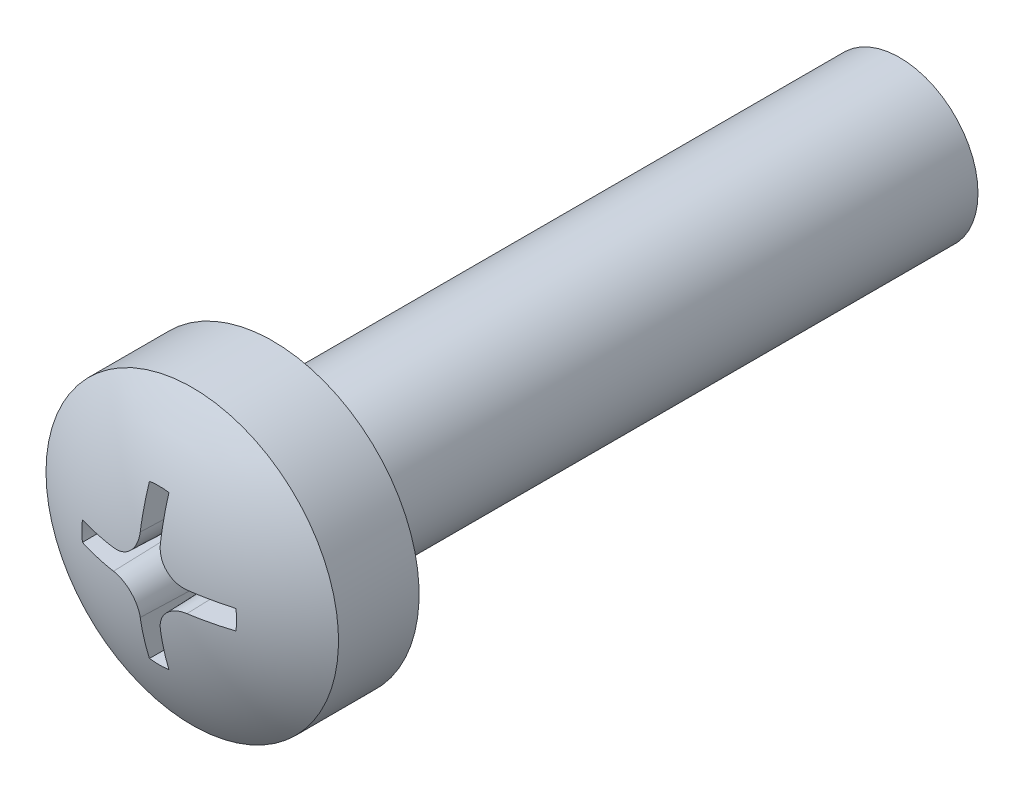
ISO-10303-21;
HEADER;
FILE_DESCRIPTION(('STEP AP214'),'2;1');
FILE_NAME('part.step','',(''),(''),'','','');
FILE_SCHEMA(('AUTOMOTIVE_DESIGN { 1 0 10303 214 1 1 1 1 }'));
ENDSEC;
DATA;
#1=APPLICATION_CONTEXT('core data for automotive mechanical design processes');
#2=APPLICATION_PROTOCOL_DEFINITION('international standard','automotive_design',2000,#1);
#3=PRODUCT_CONTEXT('',#1,'mechanical');
#4=PRODUCT('Part','Part','',(#3));
#5=PRODUCT_RELATED_PRODUCT_CATEGORY('part','',(#4));
#6=PRODUCT_DEFINITION_FORMATION('','',#4);
#7=PRODUCT_DEFINITION_CONTEXT('part definition',#1,'design');
#8=PRODUCT_DEFINITION('design','',#6,#7);
#9=PRODUCT_DEFINITION_SHAPE('','',#8);
#10=(LENGTH_UNIT() NAMED_UNIT(*) SI_UNIT(.MILLI.,.METRE.));
#11=(NAMED_UNIT(*) PLANE_ANGLE_UNIT() SI_UNIT($,.RADIAN.));
#12=(NAMED_UNIT(*) SI_UNIT($,.STERADIAN.) SOLID_ANGLE_UNIT());
#13=UNCERTAINTY_MEASURE_WITH_UNIT(LENGTH_MEASURE(1.E-05),#10,'distance_accuracy_value','');
#14=(GEOMETRIC_REPRESENTATION_CONTEXT(3) GLOBAL_UNCERTAINTY_ASSIGNED_CONTEXT((#13)) GLOBAL_UNIT_ASSIGNED_CONTEXT((#10,
#11,#12)) REPRESENTATION_CONTEXT('',''));
#15=CARTESIAN_POINT('',(0.,0.,0.));
#16=DIRECTION('',(0.,0.,1.));
#17=DIRECTION('',(1.,0.,0.));
#18=AXIS2_PLACEMENT_3D('',#15,#16,#17);
#19=CARTESIAN_POINT('',(0.,0.,12.));
#20=DIRECTION('',(0.,0.,-1.));
#21=DIRECTION('',(-1.,0.,0.));
#22=AXIS2_PLACEMENT_3D('',#19,#20,#21);
#23=CYLINDRICAL_SURFACE('',#22,1.5);
#24=CARTESIAN_POINT('',(0.,0.,12.));
#25=DIRECTION('',(0.,0.,1.));
#26=DIRECTION('',(1.,0.,0.));
#27=AXIS2_PLACEMENT_3D('',#24,#25,#26);
#28=CIRCLE('',#27,1.5);
#29=CARTESIAN_POINT('',(1.5,0.,12.));
#30=VERTEX_POINT('',#29);
#31=EDGE_CURVE('E206',#30,#30,#28,.T.);
#32=ORIENTED_EDGE('',*,*,#31,.F.);
#33=EDGE_LOOP('',(#32));
#34=FACE_BOUND('',#33,.T.);
#35=CARTESIAN_POINT('',(0.,0.,0.));
#36=DIRECTION('',(0.,0.,1.));
#37=DIRECTION('',(1.,0.,0.));
#38=AXIS2_PLACEMENT_3D('',#35,#36,#37);
#39=CIRCLE('',#38,1.5);
#40=CARTESIAN_POINT('',(1.5,0.,0.));
#41=VERTEX_POINT('',#40);
#42=EDGE_CURVE('E205',#41,#41,#39,.T.);
#43=ORIENTED_EDGE('',*,*,#42,.T.);
#44=EDGE_LOOP('',(#43));
#45=FACE_BOUND('',#44,.T.);
#46=ADVANCED_FACE('F34',(#34,#45),#23,.T.);
#47=CARTESIAN_POINT('',(0.,0.,0.));
#48=DIRECTION('',(0.,0.,1.));
#49=DIRECTION('',(1.,0.,0.));
#50=AXIS2_PLACEMENT_3D('',#47,#48,#49);
#51=PLANE('',#50);
#52=ORIENTED_EDGE('',*,*,#42,.F.);
#53=EDGE_LOOP('',(#52));
#54=FACE_BOUND('',#53,.T.);
#55=ADVANCED_FACE('F295',(#54),#51,.F.);
#56=CARTESIAN_POINT('',(0.,0.,12.));
#57=DIRECTION('',(0.,0.,-1.));
#58=DIRECTION('',(-1.,0.,0.));
#59=AXIS2_PLACEMENT_3D('',#56,#57,#58);
#60=PLANE('',#59);
#61=CARTESIAN_POINT('',(0.,0.,12.));
#62=DIRECTION('',(0.,0.,-1.));
#63=DIRECTION('',(-1.,0.,0.));
#64=AXIS2_PLACEMENT_3D('',#61,#62,#63);
#65=CIRCLE('',#64,2.79999990016222);
#66=CARTESIAN_POINT('',(-2.79999990016222,0.,12.));
#67=VERTEX_POINT('',#66);
#68=EDGE_CURVE('E202',#67,#67,#65,.T.);
#69=ORIENTED_EDGE('',*,*,#68,.T.);
#70=EDGE_LOOP('',(#69));
#71=FACE_BOUND('',#70,.T.);
#72=ORIENTED_EDGE('',*,*,#31,.T.);
#73=EDGE_LOOP('',(#72));
#74=FACE_BOUND('',#73,.T.);
#75=ADVANCED_FACE('F300',(#71,#74),#60,.T.);
#76=CARTESIAN_POINT('',(0.,0.,-0.393620134621003));
#77=DIRECTION('',(0.,0.,-1.));
#78=DIRECTION('',(-1.,0.,0.));
#79=AXIS2_PLACEMENT_3D('',#76,#77,#78);
#80=CYLINDRICAL_SURFACE('',#79,2.79999990016222);
#81=CARTESIAN_POINT('',(0.,0.,13.5424630797893));
#82=DIRECTION('',(0.,0.,-1.));
#83=DIRECTION('',(-1.,0.,0.));
#84=AXIS2_PLACEMENT_3D('',#81,#82,#83);
#85=CIRCLE('',#84,2.79999990016222);
#86=CARTESIAN_POINT('',(-2.79999990016222,0.,13.5424630797893));
#87=VERTEX_POINT('',#86);
#88=EDGE_CURVE('E150',#87,#87,#85,.T.);
#89=ORIENTED_EDGE('',*,*,#88,.T.);
#90=EDGE_LOOP('',(#89));
#91=FACE_BOUND('',#90,.T.);
#92=ORIENTED_EDGE('',*,*,#68,.F.);
#93=EDGE_LOOP('',(#92));
#94=FACE_BOUND('',#93,.T.);
#95=ADVANCED_FACE('F307',(#91,#94),#80,.T.);
#96=CARTESIAN_POINT('',(0.,0.,9.40000011175871));
#97=DIRECTION('',(0.,0.,-1.));
#98=DIRECTION('',(1.,0.,0.));
#99=AXIS2_PLACEMENT_3D('',#96,#97,#98);
#100=SPHERICAL_SURFACE('',#99,4.99999988824129);
#101=CARTESIAN_POINT('',(0.,0.,14.1754183821502));
#102=DIRECTION('',(0.,0.,-1.));
#103=DIRECTION('',(-1.,0.,0.));
#104=AXIS2_PLACEMENT_3D('',#101,#102,#103);
#105=CIRCLE('',#104,1.4816812157899);
#106=CARTESIAN_POINT('',(0.18668120666759,1.46987392394782,14.1754183821501));
#107=VERTEX_POINT('',#106);
#108=CARTESIAN_POINT('',(-0.186681206667593,1.46987392394782,14.1754183821501));
#109=VERTEX_POINT('',#108);
#110=EDGE_CURVE('E11',#107,#109,#105,.F.);
#111=ORIENTED_EDGE('',*,*,#110,.F.);
#112=CARTESIAN_POINT('',(0.0198956640512633,0.,9.39930533986049));
#113=DIRECTION('',(0.999390827019096,0.,-0.034899496702501));
#114=DIRECTION('',(-0.034899496702501,0.,-0.999390827019096));
#115=AXIS2_PLACEMENT_3D('',#112,#113,#114);
#116=CIRCLE('',#115,4.99996025606773);
#117=CARTESIAN_POINT('',(0.192632610704328,0.708178557647151,14.3458442955351));
#118=VERTEX_POINT('',#117);
#119=EDGE_CURVE('E41',#107,#118,#116,.T.);
#120=ORIENTED_EDGE('',*,*,#119,.T.);
#121=CARTESIAN_POINT('',(0.192631650862954,0.708378557647151,14.345815691475));
#122=CARTESIAN_POINT('',(0.192737639690806,0.679822741796073,14.3499041439734));
#123=CARTESIAN_POINT('',(0.195268867839181,0.651227392830896,14.3536463362414));
#124=CARTESIAN_POINT('',(0.205046889209158,0.59476703827459,14.3603460551712));
#125=CARTESIAN_POINT('',(0.212292618678018,0.566901869404939,14.3633037586285));
#126=CARTESIAN_POINT('',(0.231373694375068,0.51267267841366,14.3683466063254));
#127=CARTESIAN_POINT('',(0.24321326807329,0.486310064716558,14.3704309431667));
#128=CARTESIAN_POINT('',(0.271156607880554,0.435900324544809,14.3736603491012));
#129=CARTESIAN_POINT('',(0.287258672100205,0.411852279143786,14.3748057923215));
#130=CARTESIAN_POINT('',(0.323072075489885,0.367028886470806,14.3761158025717));
#131=CARTESIAN_POINT('',(0.342740648168188,0.346219679514825,14.3762912893596));
#132=CARTESIAN_POINT('',(0.385246757538768,0.30814670944778,14.3756853456951));
#133=CARTESIAN_POINT('',(0.408084792807392,0.290883505206881,14.3749037645383));
#134=CARTESIAN_POINT('',(0.456147210008961,0.260464262414973,14.3724133951705));
#135=CARTESIAN_POINT('',(0.481359759209805,0.247289131136679,14.3707090224733));
#136=CARTESIAN_POINT('',(0.533541444049374,0.225283958921734,14.3664258870809));
#137=CARTESIAN_POINT('',(0.560509920861877,0.216452298826715,14.3638474508254));
#138=CARTESIAN_POINT('',(0.606876295057338,0.205379627868596,14.3588207651558));
#139=CARTESIAN_POINT('',(0.626020977094074,0.201943221890059,14.3565812960749));
#140=CARTESIAN_POINT('',(0.66450204404321,0.197253494550336,14.3517582366185));
#141=CARTESIAN_POINT('',(0.683838077649067,0.195996727127303,14.349175196413));
#142=CARTESIAN_POINT('',(0.703167546290468,0.195835015722445,14.3464334662955));
#143=B_SPLINE_CURVE_WITH_KNOTS('',3,(#121,#122,#123,#124,#125,#126,#127,#128,#129,#130,#131,
#132,#133,#134,#135,#136,#137,#138,#139,#140,#141,#142),.UNSPECIFIED.,.F.,.F.,(4,2,2,2,2,2,2,2,
2,2,4),(0.,0.0864417829586744,0.172864068455127,0.259366073122684,0.345833591994609,
0.431325646912079,0.516831165542016,0.601931114274005,0.686999315371811,0.745618262708562,
0.804144447281415),.UNSPECIFIED.);
#144=CARTESIAN_POINT('',(0.702917362553185,0.19583721033533,14.3464689381926));
#145=VERTEX_POINT('',#144);
#146=EDGE_CURVE('E277',#118,#145,#143,.T.);
#147=ORIENTED_EDGE('',*,*,#146,.T.);
#148=CARTESIAN_POINT('',(0.00010539015335094,0.0259265633149154,9.39909472873738));
#149=DIRECTION('',(0.00406243901494415,0.999382570249833,-0.034899496702501));
#150=DIRECTION('',(0.,0.0348997846864301,0.999390816962434));
#151=AXIS2_PLACEMENT_3D('',#148,#149,#150);
#152=CIRCLE('',#151,4.99993258603575);
#153=CARTESIAN_POINT('',(1.46986565043204,0.186746338396853,14.1754183821502));
#154=VERTEX_POINT('',#153);
#155=EDGE_CURVE('E275',#154,#145,#152,.F.);
#156=ORIENTED_EDGE('',*,*,#155,.F.);
#157=CARTESIAN_POINT('',(0.,0.,14.1754183821502));
#158=DIRECTION('',(0.,0.,-1.));
#159=DIRECTION('',(-1.,0.,0.));
#160=AXIS2_PLACEMENT_3D('',#157,#158,#159);
#161=CIRCLE('',#160,1.4816812157899);
#162=CARTESIAN_POINT('',(1.46986565043204,-0.186746338396852,14.1754183821501));
#163=VERTEX_POINT('',#162);
#164=EDGE_CURVE('E273',#163,#154,#161,.F.);
#165=ORIENTED_EDGE('',*,*,#164,.F.);
#166=CARTESIAN_POINT('',(0.000105390153350971,-0.0259265633149169,9.39909472873738));
#167=DIRECTION('',(0.00406243901494512,-0.999382570249833,-0.034899496702501));
#168=DIRECTION('',(0.,0.0348997846864301,-0.999390816962434));
#169=AXIS2_PLACEMENT_3D('',#166,#167,#168);
#170=CIRCLE('',#169,4.99993258603575);
#171=CARTESIAN_POINT('',(0.702917362553185,-0.195837210335331,14.3464689381926));
#172=VERTEX_POINT('',#171);
#173=EDGE_CURVE('E270',#163,#172,#170,.T.);
#174=ORIENTED_EDGE('',*,*,#173,.T.);
#175=CARTESIAN_POINT('',(0.192631650862954,-0.708378557647152,14.345815691475));
#176=CARTESIAN_POINT('',(0.192737639690806,-0.679822741796074,14.3499041439734));
#177=CARTESIAN_POINT('',(0.195268867839181,-0.651227392830896,14.3536463362414));
#178=CARTESIAN_POINT('',(0.205046889209158,-0.59476703827459,14.3603460551712));
#179=CARTESIAN_POINT('',(0.212292618678018,-0.56690186940494,14.3633037586285));
#180=CARTESIAN_POINT('',(0.231373694375068,-0.512672678413661,14.3683466063254));
#181=CARTESIAN_POINT('',(0.24321326807329,-0.486310064716559,14.3704309431667));
#182=CARTESIAN_POINT('',(0.271156607880554,-0.435900324544809,14.3736603491012));
#183=CARTESIAN_POINT('',(0.287258672100205,-0.411852279143786,14.3748057923215));
#184=CARTESIAN_POINT('',(0.323072075489885,-0.367028886470807,14.3761158025717));
#185=CARTESIAN_POINT('',(0.342740648168188,-0.346219679514826,14.3762912893596));
#186=CARTESIAN_POINT('',(0.385246757538768,-0.308146709447781,14.3756853456951));
#187=CARTESIAN_POINT('',(0.408084792807392,-0.290883505206882,14.3749037645383));
#188=CARTESIAN_POINT('',(0.456147210008961,-0.260464262414974,14.3724133951705));
#189=CARTESIAN_POINT('',(0.481359759209805,-0.247289131136679,14.3707090224733));
#190=CARTESIAN_POINT('',(0.533541444049374,-0.225283958921735,14.3664258870809));
#191=CARTESIAN_POINT('',(0.560509920861878,-0.216452298826716,14.3638474508254));
#192=CARTESIAN_POINT('',(0.606876295057338,-0.205379627868597,14.3588207651558));
#193=CARTESIAN_POINT('',(0.626020977094074,-0.201943221890059,14.3565812960749));
#194=CARTESIAN_POINT('',(0.66450204404321,-0.197253494550336,14.3517582366185));
#195=CARTESIAN_POINT('',(0.683838077649067,-0.195996727127304,14.349175196413));
#196=CARTESIAN_POINT('',(0.703167546290467,-0.195835015722445,14.3464334662955));
#197=B_SPLINE_CURVE_WITH_KNOTS('',3,(#175,#176,#177,#178,#179,#180,#181,#182,#183,#184,#185,
#186,#187,#188,#189,#190,#191,#192,#193,#194,#195,#196),.UNSPECIFIED.,.F.,.F.,(4,2,2,2,2,2,2,2,
2,2,4),(0.,0.0864417829586746,0.172864068455127,0.259366073122684,0.345833591994609,
0.431325646912079,0.516831165542017,0.601931114274005,0.686999315371811,0.745618262708562,
0.804144447281414),.UNSPECIFIED.);
#198=CARTESIAN_POINT('',(0.192632610704328,-0.708178557647152,14.3458442955351));
#199=VERTEX_POINT('',#198);
#200=EDGE_CURVE('E264',#199,#172,#197,.T.);
#201=ORIENTED_EDGE('',*,*,#200,.F.);
#202=CARTESIAN_POINT('',(0.0198956640512633,0.,9.39930533986049));
#203=DIRECTION('',(0.999390827019096,0.,-0.034899496702501));
#204=DIRECTION('',(-0.034899496702501,0.,-0.999390827019096));
#205=AXIS2_PLACEMENT_3D('',#202,#203,#204);
#206=CIRCLE('',#205,4.99996025606773);
#207=CARTESIAN_POINT('',(0.186681206667591,-1.46987392394782,14.1754183821502));
#208=VERTEX_POINT('',#207);
#209=EDGE_CURVE('E262',#208,#199,#206,.F.);
#210=ORIENTED_EDGE('',*,*,#209,.F.);
#211=CARTESIAN_POINT('',(0.,0.,14.1754183821502));
#212=DIRECTION('',(0.,0.,-1.));
#213=DIRECTION('',(-1.,0.,0.));
#214=AXIS2_PLACEMENT_3D('',#211,#212,#213);
#215=CIRCLE('',#214,1.4816812157899);
#216=CARTESIAN_POINT('',(-0.186681206667593,-1.46987392394782,14.1754183821501));
#217=VERTEX_POINT('',#216);
#218=EDGE_CURVE('E259',#208,#217,#215,.T.);
#219=ORIENTED_EDGE('',*,*,#218,.T.);
#220=CARTESIAN_POINT('',(-0.0198956640512654,0.,9.39930533986049));
#221=DIRECTION('',(-0.999390827019096,0.,-0.034899496702501));
#222=DIRECTION('',(-0.034899496702501,0.,0.999390827019096));
#223=AXIS2_PLACEMENT_3D('',#220,#221,#222);
#224=CIRCLE('',#223,4.99996025606773);
#225=CARTESIAN_POINT('',(-0.19263261070433,-0.708178557647151,14.3458442955351));
#226=VERTEX_POINT('',#225);
#227=EDGE_CURVE('E255',#217,#226,#224,.T.);
#228=ORIENTED_EDGE('',*,*,#227,.T.);
#229=CARTESIAN_POINT('',(-0.70316754629047,-0.195835015722445,14.3464334662955));
#230=CARTESIAN_POINT('',(-0.674619447950853,-0.196052963217916,14.3504857241648));
#231=CARTESIAN_POINT('',(-0.64604143463723,-0.198695168407334,14.3541890416191));
#232=CARTESIAN_POINT('',(-0.589634494727846,-0.208689654905481,14.3608068014756));
#233=CARTESIAN_POINT('',(-0.561805393198953,-0.216040826152062,14.3637214295682));
#234=CARTESIAN_POINT('',(-0.50766612082123,-0.235323893103952,14.3686750861046));
#235=CARTESIAN_POINT('',(-0.481357369172765,-0.247259991703852,14.370713307523));
#236=CARTESIAN_POINT('',(-0.431071022991569,-0.275383990623327,14.3738489099634));
#237=CARTESIAN_POINT('',(-0.407092510169895,-0.291570206692358,14.3749466629444));
#238=CARTESIAN_POINT('',(-0.362416703115867,-0.327538701485094,14.3761618083202));
#239=CARTESIAN_POINT('',(-0.34168588735275,-0.347278991317759,14.376289966384));
#240=CARTESIAN_POINT('',(-0.303780328011577,-0.389912448398922,14.375590364716));
#241=CARTESIAN_POINT('',(-0.286606147147997,-0.412806113607388,14.3747624538554));
#242=CARTESIAN_POINT('',(-0.256366858084051,-0.460969475916929,14.3721816258056));
#243=CARTESIAN_POINT('',(-0.243283863198687,-0.486228184526672,14.3704328274806));
#244=CARTESIAN_POINT('',(-0.22146899790456,-0.538485231439468,14.366063898297));
#245=CARTESIAN_POINT('',(-0.212735526227358,-0.565482925398504,14.3634440886927));
#246=CARTESIAN_POINT('',(-0.201823996880683,-0.61191361527353,14.3583478129874));
#247=CARTESIAN_POINT('',(-0.198453223120025,-0.631098599357625,14.3560784464194));
#248=CARTESIAN_POINT('',(-0.193901764340931,-0.669652448873598,14.3511968730386));
#249=CARTESIAN_POINT('',(-0.192717622166763,-0.689020975292663,14.3485852144187));
#250=CARTESIAN_POINT('',(-0.192631650862956,-0.708378557647151,14.345815691475));
#251=B_SPLINE_CURVE_WITH_KNOTS('',3,(#229,#230,#231,#232,#233,#234,#235,#236,#237,#238,#239,
#240,#241,#242,#243,#244,#245,#246,#247,#248,#249,#250),.UNSPECIFIED.,.F.,.F.,(4,2,2,2,2,2,2,2,
2,2,4),(0.,0.086405343611419,0.172790326060609,0.259254685287909,0.34568483171133,
0.431153892876567,0.51663646625136,0.601739908197796,0.686811996276178,0.745524819849982,
0.804144736260156),.UNSPECIFIED.);
#252=CARTESIAN_POINT('',(-0.702917362553187,-0.195837210335331,14.3464689381926));
#253=VERTEX_POINT('',#252);
#254=EDGE_CURVE('E248',#253,#226,#251,.T.);
#255=ORIENTED_EDGE('',*,*,#254,.F.);
#256=CARTESIAN_POINT('',(-0.000105390153349066,-0.0259265633149168,9.39909472873738));
#257=DIRECTION('',(-0.0040624390149453,-0.999382570249833,-0.034899496702501));
#258=DIRECTION('',(0.,0.0348997846864301,-0.999390816962434));
#259=AXIS2_PLACEMENT_3D('',#256,#257,#258);
#260=CIRCLE('',#259,4.99993258603575);
#261=CARTESIAN_POINT('',(-1.46986565043204,-0.186746338396853,14.1754183821502));
#262=VERTEX_POINT('',#261);
#263=EDGE_CURVE('E256',#262,#253,#260,.F.);
#264=ORIENTED_EDGE('',*,*,#263,.F.);
#265=CARTESIAN_POINT('',(0.,0.,14.1754183821502));
#266=DIRECTION('',(0.,0.,-1.));
#267=DIRECTION('',(-1.,0.,0.));
#268=AXIS2_PLACEMENT_3D('',#265,#266,#267);
#269=CIRCLE('',#268,1.4816812157899);
#270=CARTESIAN_POINT('',(-1.46986565043204,0.186746338396852,14.1754183821501));
#271=VERTEX_POINT('',#270);
#272=EDGE_CURVE('E594',#262,#271,#269,.T.);
#273=ORIENTED_EDGE('',*,*,#272,.T.);
#274=CARTESIAN_POINT('',(-0.000105390153349066,0.0259265633149168,9.39909472873738));
#275=DIRECTION('',(-0.00406243901494529,0.999382570249833,-0.034899496702501));
#276=DIRECTION('',(0.,0.0348997846864301,0.999390816962434));
#277=AXIS2_PLACEMENT_3D('',#274,#275,#276);
#278=CIRCLE('',#277,4.99993258603575);
#279=CARTESIAN_POINT('',(-0.702917362553187,0.195837210335331,14.3464689381926));
#280=VERTEX_POINT('',#279);
#281=EDGE_CURVE('E221',#271,#280,#278,.T.);
#282=ORIENTED_EDGE('',*,*,#281,.T.);
#283=CARTESIAN_POINT('',(-0.192631650862955,0.708378557647151,14.345815691475));
#284=CARTESIAN_POINT('',(-0.192737639690808,0.679822741796074,14.3499041439734));
#285=CARTESIAN_POINT('',(-0.195268867839183,0.651227392830896,14.3536463362414));
#286=CARTESIAN_POINT('',(-0.20504688920916,0.59476703827459,14.3603460551712));
#287=CARTESIAN_POINT('',(-0.21229261867802,0.566901869404939,14.3633037586285));
#288=CARTESIAN_POINT('',(-0.231373694375069,0.51267267841366,14.3683466063254));
#289=CARTESIAN_POINT('',(-0.243213268073292,0.486310064716559,14.3704309431667));
#290=CARTESIAN_POINT('',(-0.271156607880555,0.435900324544809,14.3736603491012));
#291=CARTESIAN_POINT('',(-0.287258672100206,0.411852279143786,14.3748057923215));
#292=CARTESIAN_POINT('',(-0.323072075489887,0.367028886470806,14.3761158025717));
#293=CARTESIAN_POINT('',(-0.34274064816819,0.346219679514826,14.3762912893596));
#294=CARTESIAN_POINT('',(-0.38524675753877,0.30814670944778,14.3756853456951));
#295=CARTESIAN_POINT('',(-0.408084792807394,0.290883505206882,14.3749037645383));
#296=CARTESIAN_POINT('',(-0.456147210008963,0.260464262414974,14.3724133951705));
#297=CARTESIAN_POINT('',(-0.481359759209807,0.247289131136679,14.3707090224733));
#298=CARTESIAN_POINT('',(-0.533541444049376,0.225283958921735,14.3664258870809));
#299=CARTESIAN_POINT('',(-0.560509920861879,0.216452298826716,14.3638474508254));
#300=CARTESIAN_POINT('',(-0.60687629505734,0.205379627868597,14.3588207651558));
#301=CARTESIAN_POINT('',(-0.626020977094076,0.201943221890059,14.3565812960749));
#302=CARTESIAN_POINT('',(-0.664502044043212,0.197253494550336,14.3517582366185));
#303=CARTESIAN_POINT('',(-0.683838077649068,0.195996727127304,14.349175196413));
#304=CARTESIAN_POINT('',(-0.703167546290469,0.195835015722445,14.3464334662955));
#305=B_SPLINE_CURVE_WITH_KNOTS('',3,(#283,#284,#285,#286,#287,#288,#289,#290,#291,#292,#293,
#294,#295,#296,#297,#298,#299,#300,#301,#302,#303,#304),.UNSPECIFIED.,.F.,.F.,(4,2,2,2,2,2,2,2,
2,2,4),(0.,0.0864417829586746,0.172864068455127,0.259366073122684,0.345833591994609,
0.431325646912079,0.516831165542016,0.601931114274005,0.686999315371811,0.745618262708561,
0.804144447281414),.UNSPECIFIED.);
#306=CARTESIAN_POINT('',(-0.19263261070433,0.708178557647151,14.3458442955351));
#307=VERTEX_POINT('',#306);
#308=EDGE_CURVE('E213',#307,#280,#305,.T.);
#309=ORIENTED_EDGE('',*,*,#308,.F.);
#310=CARTESIAN_POINT('',(-0.0198956640512644,0.,9.39930533986049));
#311=DIRECTION('',(-0.999390827019096,0.,-0.034899496702501));
#312=DIRECTION('',(-0.034899496702501,0.,0.999390827019096));
#313=AXIS2_PLACEMENT_3D('',#310,#311,#312);
#314=CIRCLE('',#313,4.99996025606773);
#315=EDGE_CURVE('E209',#109,#307,#314,.F.);
#316=ORIENTED_EDGE('',*,*,#315,.F.);
#317=EDGE_LOOP('',(#111,#120,#147,#156,#165,#174,#201,#210,#219,#228,#255,#264,#273,#282,#309,#316));
#318=FACE_BOUND('',#317,.T.);
#319=ORIENTED_EDGE('',*,*,#88,.F.);
#320=EDGE_LOOP('',(#319));
#321=FACE_BOUND('',#320,.T.);
#322=ADVANCED_FACE('F223',(#318,#321),#100,.T.);
#323=CARTESIAN_POINT('',(0.,0.,14.7000001));
#324=DIRECTION('',(0.,0.,1.));
#325=DIRECTION('',(1.,0.,0.));
#326=AXIS2_PLACEMENT_3D('',#323,#324,#325);
#327=CONICAL_SURFACE('',#326,1.50000001303852,0.0349065850398867);
#328=ORIENTED_EDGE('',*,*,#110,.T.);
#329=CARTESIAN_POINT('',(-0.142142619910814,1.43009594495933,12.9000001309199));
#330=CARTESIAN_POINT('',(-0.152618658076336,1.43957885994155,13.1999946132293));
#331=CARTESIAN_POINT('',(-0.163094792502732,1.4489727928664,13.4999918520894));
#332=CARTESIAN_POINT('',(-0.184047253837866,1.46758269456637,14.0999918417828));
#333=CARTESIAN_POINT('',(-0.194523580746602,1.47679866334215,14.399994592616));
#334=CARTESIAN_POINT('',(-0.205000003916213,1.48592565006124,14.7000001));
#335=B_SPLINE_CURVE_WITH_KNOTS('',3,(#329,#330,#331,#332,#333,#334),.UNSPECIFIED.,.F.,.F.,(4,2,
4),(0.,0.900981158642231,1.80196231389533),.UNSPECIFIED.);
#336=CARTESIAN_POINT('',(-0.142142619910814,1.43009594495933,12.9000001309199));
#337=VERTEX_POINT('',#336);
#338=EDGE_CURVE('E48',#337,#109,#335,.T.);
#339=ORIENTED_EDGE('',*,*,#338,.F.);
#340=CARTESIAN_POINT('',(0.,0.,12.9000001309199));
#341=DIRECTION('',(0.,0.,1.));
#342=DIRECTION('',(1.,0.,0.));
#343=AXIS2_PLACEMENT_3D('',#340,#341,#342);
#344=CIRCLE('',#343,1.43714262903312);
#345=CARTESIAN_POINT('',(0.142142619910811,1.43009594495933,12.9000001309199));
#346=VERTEX_POINT('',#345);
#347=EDGE_CURVE('E158',#346,#337,#344,.T.);
#348=ORIENTED_EDGE('',*,*,#347,.F.);
#349=CARTESIAN_POINT('',(0.142142619910811,1.43009594495933,12.9000001309199));
#350=CARTESIAN_POINT('',(0.152618658076333,1.43957885994155,13.1999946132293));
#351=CARTESIAN_POINT('',(0.16309479250273,1.4489727928664,13.4999918520894));
#352=CARTESIAN_POINT('',(0.184047253837863,1.46758269456637,14.0999918417828));
#353=CARTESIAN_POINT('',(0.1945235807466,1.47679866334215,14.399994592616));
#354=CARTESIAN_POINT('',(0.205000003916211,1.48592565006124,14.7000001));
#355=B_SPLINE_CURVE_WITH_KNOTS('',3,(#349,#350,#351,#352,#353,#354),.UNSPECIFIED.,.F.,.F.,(4,2,
4),(0.,0.900981158642231,1.80196231389533),.UNSPECIFIED.);
#356=EDGE_CURVE('E142',#346,#107,#355,.T.);
#357=ORIENTED_EDGE('',*,*,#356,.T.);
#358=EDGE_LOOP('',(#328,#339,#348,#357));
#359=FACE_BOUND('',#358,.T.);
#360=ADVANCED_FACE('F162',(#359),#327,.F.);
#361=CARTESIAN_POINT('',(0.205000003916211,1.48592565006124,14.7000001));
#362=DIRECTION('',(0.999390827019096,0.,-0.034899496702501));
#363=DIRECTION('',(-0.034899496702501,0.,-0.999390827019096));
#364=AXIS2_PLACEMENT_3D('',#361,#362,#363);
#365=PLANE('',#364);
#366=ORIENTED_EDGE('',*,*,#356,.F.);
#367=DIRECTION('',(0.,1.,0.));
#368=VECTOR('',#367,1.);
#369=CARTESIAN_POINT('',(0.142142619910812,0.,12.9000001309199));
#370=LINE('',#369,#368);
#371=CARTESIAN_POINT('',(0.142142619910811,0.708178557647151,12.9000001309199));
#372=VERTEX_POINT('',#371);
#373=EDGE_CURVE('E145',#346,#372,#370,.F.);
#374=ORIENTED_EDGE('',*,*,#373,.T.);
#375=DIRECTION('',(0.034899496702501,0.,0.999390827019096));
#376=VECTOR('',#375,1.);
#377=CARTESIAN_POINT('',(0.20500000391621,0.708178557647151,14.7000001));
#378=LINE('',#377,#376);
#379=EDGE_CURVE('E151',#372,#118,#378,.T.);
#380=ORIENTED_EDGE('',*,*,#379,.T.);
#381=ORIENTED_EDGE('',*,*,#119,.F.);
#382=EDGE_LOOP('',(#366,#374,#380,#381));
#383=FACE_BOUND('',#382,.T.);
#384=ADVANCED_FACE('F144',(#383),#365,.F.);
#385=CARTESIAN_POINT('',(0.705000003916211,0.708178557647151,14.7000001));
#386=DIRECTION('',(0.,0.,-1.));
#387=DIRECTION('',(1.,0.,0.));
#388=AXIS2_PLACEMENT_3D('',#385,#386,#387);
#389=CONICAL_SURFACE('',#388,0.5,0.0349065850398867);
#390=ORIENTED_EDGE('',*,*,#379,.F.);
#391=CARTESIAN_POINT('',(0.705000003916211,0.708178557647151,12.9000001309199));
#392=DIRECTION('',(0.,0.,1.));
#393=DIRECTION('',(1.,0.,0.));
#394=AXIS2_PLACEMENT_3D('',#391,#392,#393);
#395=CIRCLE('',#394,0.562857384005399);
#396=CARTESIAN_POINT('',(0.702712036351556,0.145325823858085,12.9000001309199));
#397=VERTEX_POINT('',#396);
#398=EDGE_CURVE('E160',#372,#397,#395,.T.);
#399=ORIENTED_EDGE('',*,*,#398,.T.);
#400=DIRECTION('',(0.000141863496415148,0.0348992083697649,0.999390827019096));
#401=VECTOR('',#400,1.);
#402=CARTESIAN_POINT('',(0.702967546290468,0.208182688548215,14.7000001));
#403=LINE('',#402,#401);
#404=EDGE_CURVE('E420',#397,#145,#403,.T.);
#405=ORIENTED_EDGE('',*,*,#404,.T.);
#406=ORIENTED_EDGE('',*,*,#146,.F.);
#407=EDGE_LOOP('',(#390,#399,#405,#406));
#408=FACE_BOUND('',#407,.T.);
#409=ADVANCED_FACE('F283',(#408),#389,.T.);
#410=CARTESIAN_POINT('',(1.48592565006123,0.205000003916213,14.7000001));
#411=DIRECTION('',(0.00406243901494415,0.999382570249833,-0.034899496702501));
#412=DIRECTION('',(0.,0.0348997846864301,0.999390816962434));
#413=AXIS2_PLACEMENT_3D('',#410,#411,#412);
#414=PLANE('',#413);
#415=ORIENTED_EDGE('',*,*,#155,.T.);
#416=ORIENTED_EDGE('',*,*,#404,.F.);
#417=DIRECTION('',(-0.99999173819787,0.00406491525148502,0.));
#418=VECTOR('',#417,1.);
#419=CARTESIAN_POINT('',(0.000602343564913371,0.148179863836023,12.9000001309199));
#420=LINE('',#419,#418);
#421=CARTESIAN_POINT('',(1.43007341244828,0.142369137079488,12.9000001309199));
#422=VERTEX_POINT('',#421);
#423=EDGE_CURVE('E171',#422,#397,#420,.T.);
#424=ORIENTED_EDGE('',*,*,#423,.F.);
#425=CARTESIAN_POINT('',(1.43007341244828,0.142369137079488,12.9000001309199));
#426=CARTESIAN_POINT('',(1.43955869120937,0.152806706922151,13.1999946790441));
#427=CARTESIAN_POINT('',(1.44895568373278,0.163244730756208,13.4999919508073));
#428=CARTESIAN_POINT('',(1.46757309626977,0.184121686368453,14.0999919405007));
#429=CARTESIAN_POINT('',(1.47679351628402,0.194560618146638,14.3999946584309));
#430=CARTESIAN_POINT('',(1.48592565006123,0.205000003916213,14.7000001));
#431=B_SPLINE_CURVE_WITH_KNOTS('',3,(#425,#426,#427,#428,#429,#430),.UNSPECIFIED.,.F.,.F.,(4,2,
4),(0.,0.900977563471273,1.80195512360615),.UNSPECIFIED.);
#432=EDGE_CURVE('E414',#422,#154,#431,.T.);
#433=ORIENTED_EDGE('',*,*,#432,.T.);
#434=EDGE_LOOP('',(#415,#416,#424,#433));
#435=FACE_BOUND('',#434,.T.);
#436=ADVANCED_FACE('F235',(#435),#414,.F.);
#437=CARTESIAN_POINT('',(0.,0.,14.7000001));
#438=DIRECTION('',(0.,0.,1.));
#439=DIRECTION('',(1.,0.,0.));
#440=AXIS2_PLACEMENT_3D('',#437,#438,#439);
#441=CONICAL_SURFACE('',#440,1.50000001303852,0.0349065850398867);
#442=ORIENTED_EDGE('',*,*,#164,.T.);
#443=ORIENTED_EDGE('',*,*,#432,.F.);
#444=CARTESIAN_POINT('',(0.,0.,12.9000001309199));
#445=DIRECTION('',(0.,0.,1.));
#446=DIRECTION('',(1.,0.,0.));
#447=AXIS2_PLACEMENT_3D('',#444,#445,#446);
#448=CIRCLE('',#447,1.43714262903312);
#449=CARTESIAN_POINT('',(1.43007341244828,-0.142369137079488,12.9000001309199));
#450=VERTEX_POINT('',#449);
#451=EDGE_CURVE('E173',#450,#422,#448,.T.);
#452=ORIENTED_EDGE('',*,*,#451,.F.);
#453=CARTESIAN_POINT('',(1.43007341244828,-0.142369137079488,12.9000001309199));
#454=CARTESIAN_POINT('',(1.43955869120937,-0.152806706922151,13.1999946790441));
#455=CARTESIAN_POINT('',(1.44895568373278,-0.163244730756208,13.4999919508073));
#456=CARTESIAN_POINT('',(1.46757309626977,-0.184121686368453,14.0999919405007));
#457=CARTESIAN_POINT('',(1.47679351628402,-0.194560618146638,14.3999946584309));
#458=CARTESIAN_POINT('',(1.48592565006123,-0.205000003916213,14.7000001));
#459=B_SPLINE_CURVE_WITH_KNOTS('',3,(#453,#454,#455,#456,#457,#458),.UNSPECIFIED.,.F.,.F.,(4,2,
4),(0.,0.900977563471273,1.80195512360615),.UNSPECIFIED.);
#460=EDGE_CURVE('E408',#450,#163,#459,.T.);
#461=ORIENTED_EDGE('',*,*,#460,.T.);
#462=EDGE_LOOP('',(#442,#443,#452,#461));
#463=FACE_BOUND('',#462,.T.);
#464=ADVANCED_FACE('F291',(#463),#441,.F.);
#465=CARTESIAN_POINT('',(1.48592565006123,-0.205000003916213,14.7000001));
#466=DIRECTION('',(0.00406243901494512,-0.999382570249833,-0.034899496702501));
#467=DIRECTION('',(0.,0.0348997846864301,-0.999390816962434));
#468=AXIS2_PLACEMENT_3D('',#465,#466,#467);
#469=PLANE('',#468);
#470=ORIENTED_EDGE('',*,*,#460,.F.);
#471=DIRECTION('',(0.99999173819787,0.00406491525148599,0.));
#472=VECTOR('',#471,1.);
#473=CARTESIAN_POINT('',(0.00060234356491352,-0.148179863836024,12.9000001309199));
#474=LINE('',#473,#472);
#475=CARTESIAN_POINT('',(0.702712036351556,-0.145325823858086,12.9000001309199));
#476=VERTEX_POINT('',#475);
#477=EDGE_CURVE('E176',#450,#476,#474,.F.);
#478=ORIENTED_EDGE('',*,*,#477,.T.);
#479=DIRECTION('',(0.000141863496415188,-0.0348992083697649,0.999390827019096));
#480=VECTOR('',#479,1.);
#481=CARTESIAN_POINT('',(0.702967546290468,-0.208182688548216,14.7000001));
#482=LINE('',#481,#480);
#483=EDGE_CURVE('E430',#476,#172,#482,.T.);
#484=ORIENTED_EDGE('',*,*,#483,.T.);
#485=ORIENTED_EDGE('',*,*,#173,.F.);
#486=EDGE_LOOP('',(#470,#478,#484,#485));
#487=FACE_BOUND('',#486,.T.);
#488=ADVANCED_FACE('F403',(#487),#469,.F.);
#489=CARTESIAN_POINT('',(0.705000003916211,-0.708178557647152,14.7000001));
#490=DIRECTION('',(0.,0.,-1.));
#491=DIRECTION('',(-1.,0.,0.));
#492=AXIS2_PLACEMENT_3D('',#489,#490,#491);
#493=CONICAL_SURFACE('',#492,0.5,0.0349065850398867);
#494=ORIENTED_EDGE('',*,*,#200,.T.);
#495=ORIENTED_EDGE('',*,*,#483,.F.);
#496=CARTESIAN_POINT('',(0.705000003916211,-0.708178557647152,12.9000001309199));
#497=DIRECTION('',(0.,0.,1.));
#498=DIRECTION('',(1.,0.,0.));
#499=AXIS2_PLACEMENT_3D('',#496,#497,#498);
#500=CIRCLE('',#499,0.562857384005399);
#501=CARTESIAN_POINT('',(0.142142619910812,-0.708178557647152,12.9000001309199));
#502=VERTEX_POINT('',#501);
#503=EDGE_CURVE('E178',#502,#476,#500,.F.);
#504=ORIENTED_EDGE('',*,*,#503,.F.);
#505=DIRECTION('',(0.034899496702501,0.,0.999390827019096));
#506=VECTOR('',#505,1.);
#507=CARTESIAN_POINT('',(0.205000003916211,-0.708178557647152,14.7000001));
#508=LINE('',#507,#506);
#509=EDGE_CURVE('E394',#502,#199,#508,.T.);
#510=ORIENTED_EDGE('',*,*,#509,.T.);
#511=EDGE_LOOP('',(#494,#495,#504,#510));
#512=FACE_BOUND('',#511,.T.);
#513=ADVANCED_FACE('F245',(#512),#493,.T.);
#514=CARTESIAN_POINT('',(0.205000003916211,-1.48592565006124,14.7000001));
#515=DIRECTION('',(0.999390827019096,0.,-0.034899496702501));
#516=DIRECTION('',(-0.034899496702501,0.,-0.999390827019096));
#517=AXIS2_PLACEMENT_3D('',#514,#515,#516);
#518=PLANE('',#517);
#519=ORIENTED_EDGE('',*,*,#209,.T.);
#520=ORIENTED_EDGE('',*,*,#509,.F.);
#521=DIRECTION('',(0.,1.,0.));
#522=VECTOR('',#521,1.);
#523=CARTESIAN_POINT('',(0.142142619910812,0.,12.9000001309199));
#524=LINE('',#523,#522);
#525=CARTESIAN_POINT('',(0.142142619910811,-1.43009594495933,12.9000001309199));
#526=VERTEX_POINT('',#525);
#527=EDGE_CURVE('E181',#526,#502,#524,.T.);
#528=ORIENTED_EDGE('',*,*,#527,.F.);
#529=CARTESIAN_POINT('',(0.142142619910811,-1.43009594495933,12.9000001309199));
#530=CARTESIAN_POINT('',(0.152618658076333,-1.43957885994155,13.1999946132293));
#531=CARTESIAN_POINT('',(0.16309479250273,-1.4489727928664,13.4999918520894));
#532=CARTESIAN_POINT('',(0.184047253837863,-1.46758269456637,14.0999918417828));
#533=CARTESIAN_POINT('',(0.1945235807466,-1.47679866334215,14.399994592616));
#534=CARTESIAN_POINT('',(0.205000003916211,-1.48592565006124,14.7000001));
#535=B_SPLINE_CURVE_WITH_KNOTS('',3,(#529,#530,#531,#532,#533,#534),.UNSPECIFIED.,.F.,.F.,(4,2,
4),(0.,0.900981158642231,1.80196231389533),.UNSPECIFIED.);
#536=EDGE_CURVE('E386',#526,#208,#535,.T.);
#537=ORIENTED_EDGE('',*,*,#536,.T.);
#538=EDGE_LOOP('',(#519,#520,#528,#537));
#539=FACE_BOUND('',#538,.T.);
#540=ADVANCED_FACE('F396',(#539),#518,.F.);
#541=CARTESIAN_POINT('',(0.,0.,14.7000001));
#542=DIRECTION('',(0.,0.,1.));
#543=DIRECTION('',(-1.,0.,0.));
#544=AXIS2_PLACEMENT_3D('',#541,#542,#543);
#545=CONICAL_SURFACE('',#544,1.50000001303852,0.0349065850398867);
#546=ORIENTED_EDGE('',*,*,#536,.F.);
#547=CARTESIAN_POINT('',(0.,0.,12.9000001309199));
#548=DIRECTION('',(0.,0.,1.));
#549=DIRECTION('',(1.,0.,0.));
#550=AXIS2_PLACEMENT_3D('',#547,#548,#549);
#551=CIRCLE('',#550,1.43714262903312);
#552=CARTESIAN_POINT('',(-0.142142619910814,-1.43009594495933,12.9000001309199));
#553=VERTEX_POINT('',#552);
#554=EDGE_CURVE('E184',#526,#553,#551,.F.);
#555=ORIENTED_EDGE('',*,*,#554,.T.);
#556=CARTESIAN_POINT('',(-0.142142619910814,-1.43009594495933,12.9000001309199));
#557=CARTESIAN_POINT('',(-0.152618658076336,-1.43957885994155,13.1999946132293));
#558=CARTESIAN_POINT('',(-0.163094792502732,-1.4489727928664,13.4999918520894));
#559=CARTESIAN_POINT('',(-0.184047253837866,-1.46758269456637,14.0999918417828));
#560=CARTESIAN_POINT('',(-0.194523580746602,-1.47679866334215,14.399994592616));
#561=CARTESIAN_POINT('',(-0.205000003916213,-1.48592565006124,14.7000001));
#562=B_SPLINE_CURVE_WITH_KNOTS('',3,(#556,#557,#558,#559,#560,#561),.UNSPECIFIED.,.F.,.F.,(4,2,
4),(0.,0.900981158642231,1.80196231389533),.UNSPECIFIED.);
#563=EDGE_CURVE('E378',#553,#217,#562,.T.);
#564=ORIENTED_EDGE('',*,*,#563,.T.);
#565=ORIENTED_EDGE('',*,*,#218,.F.);
#566=EDGE_LOOP('',(#546,#555,#564,#565));
#567=FACE_BOUND('',#566,.T.);
#568=ADVANCED_FACE('F373',(#567),#545,.F.);
#569=CARTESIAN_POINT('',(-0.205000003916213,-1.48592565006124,14.7000001));
#570=DIRECTION('',(-0.999390827019096,0.,-0.034899496702501));
#571=DIRECTION('',(-0.034899496702501,0.,0.999390827019096));
#572=AXIS2_PLACEMENT_3D('',#569,#570,#571);
#573=PLANE('',#572);
#574=ORIENTED_EDGE('',*,*,#563,.F.);
#575=DIRECTION('',(0.,-1.,0.));
#576=VECTOR('',#575,1.);
#577=CARTESIAN_POINT('',(-0.142142619910814,0.,12.9000001309199));
#578=LINE('',#577,#576);
#579=CARTESIAN_POINT('',(-0.142142619910814,-0.708178557647151,12.9000001309199));
#580=VERTEX_POINT('',#579);
#581=EDGE_CURVE('E186',#553,#580,#578,.F.);
#582=ORIENTED_EDGE('',*,*,#581,.T.);
#583=DIRECTION('',(-0.034899496702501,0.,0.999390827019096));
#584=VECTOR('',#583,1.);
#585=CARTESIAN_POINT('',(-0.205000003916213,-0.708178557647151,14.7000001));
#586=LINE('',#585,#584);
#587=EDGE_CURVE('E387',#580,#226,#586,.T.);
#588=ORIENTED_EDGE('',*,*,#587,.T.);
#589=ORIENTED_EDGE('',*,*,#227,.F.);
#590=EDGE_LOOP('',(#574,#582,#588,#589));
#591=FACE_BOUND('',#590,.T.);
#592=ADVANCED_FACE('F243',(#591),#573,.F.);
#593=CARTESIAN_POINT('',(-0.705000003916213,-0.708178557647151,14.7000001));
#594=DIRECTION('',(0.,0.,-1.));
#595=DIRECTION('',(-1.,0.,0.));
#596=AXIS2_PLACEMENT_3D('',#593,#594,#595);
#597=CONICAL_SURFACE('',#596,0.5,0.0349065850398867);
#598=ORIENTED_EDGE('',*,*,#254,.T.);
#599=ORIENTED_EDGE('',*,*,#587,.F.);
#600=CARTESIAN_POINT('',(-0.705000003916213,-0.708178557647151,12.9000001309199));
#601=DIRECTION('',(0.,0.,1.));
#602=DIRECTION('',(1.,0.,0.));
#603=AXIS2_PLACEMENT_3D('',#600,#601,#602);
#604=CIRCLE('',#603,0.562857384005399);
#605=CARTESIAN_POINT('',(-0.702712036351558,-0.145325823858086,12.9000001309199));
#606=VERTEX_POINT('',#605);
#607=EDGE_CURVE('E188',#606,#580,#604,.F.);
#608=ORIENTED_EDGE('',*,*,#607,.F.);
#609=DIRECTION('',(-0.000141863496415188,-0.0348992083697649,0.999390827019096));
#610=VECTOR('',#609,1.);
#611=CARTESIAN_POINT('',(-0.70296754629047,-0.208182688548216,14.7000001));
#612=LINE('',#611,#610);
#613=EDGE_CURVE('E586',#606,#253,#612,.T.);
#614=ORIENTED_EDGE('',*,*,#613,.T.);
#615=EDGE_LOOP('',(#598,#599,#608,#614));
#616=FACE_BOUND('',#615,.T.);
#617=ADVANCED_FACE('F238',(#616),#597,.T.);
#618=CARTESIAN_POINT('',(-1.48592565006124,-0.205000003916213,14.7000001));
#619=DIRECTION('',(-0.0040624390149453,-0.999382570249833,-0.034899496702501));
#620=DIRECTION('',(0.,0.0348997846864301,-0.999390816962434));
#621=AXIS2_PLACEMENT_3D('',#618,#619,#620);
#622=PLANE('',#621);
#623=ORIENTED_EDGE('',*,*,#263,.T.);
#624=ORIENTED_EDGE('',*,*,#613,.F.);
#625=DIRECTION('',(0.99999173819787,-0.00406491525148617,0.));
#626=VECTOR('',#625,1.);
#627=CARTESIAN_POINT('',(-0.000602343564913546,-0.148179863836024,12.9000001309199));
#628=LINE('',#627,#626);
#629=CARTESIAN_POINT('',(-1.43007341244828,-0.142369137079487,12.9000001309199));
#630=VERTEX_POINT('',#629);
#631=EDGE_CURVE('E191',#630,#606,#628,.T.);
#632=ORIENTED_EDGE('',*,*,#631,.F.);
#633=CARTESIAN_POINT('',(-1.43007341244828,-0.142369137079487,12.9000001309199));
#634=CARTESIAN_POINT('',(-1.43955869120937,-0.152806706922151,13.1999946790441));
#635=CARTESIAN_POINT('',(-1.44895568373278,-0.163244730756207,13.4999919508073));
#636=CARTESIAN_POINT('',(-1.46757309626978,-0.184121686368453,14.0999919405007));
#637=CARTESIAN_POINT('',(-1.47679351628402,-0.194560618146638,14.3999946584309));
#638=CARTESIAN_POINT('',(-1.48592565006124,-0.205000003916213,14.7000001));
#639=B_SPLINE_CURVE_WITH_KNOTS('',3,(#633,#634,#635,#636,#637,#638),.UNSPECIFIED.,.F.,.F.,(4,2,
4),(0.,0.900977563471273,1.80195512360615),.UNSPECIFIED.);
#640=EDGE_CURVE('E353',#630,#262,#639,.T.);
#641=ORIENTED_EDGE('',*,*,#640,.T.);
#642=EDGE_LOOP('',(#623,#624,#632,#641));
#643=FACE_BOUND('',#642,.T.);
#644=ADVANCED_FACE('F242',(#643),#622,.F.);
#645=CARTESIAN_POINT('',(0.,0.,14.7000001));
#646=DIRECTION('',(0.,0.,1.));
#647=DIRECTION('',(-1.,0.,0.));
#648=AXIS2_PLACEMENT_3D('',#645,#646,#647);
#649=CONICAL_SURFACE('',#648,1.50000001303852,0.0349065850398867);
#650=ORIENTED_EDGE('',*,*,#640,.F.);
#651=CARTESIAN_POINT('',(0.,0.,12.9000001309199));
#652=DIRECTION('',(0.,0.,1.));
#653=DIRECTION('',(1.,0.,0.));
#654=AXIS2_PLACEMENT_3D('',#651,#652,#653);
#655=CIRCLE('',#654,1.43714262903312);
#656=CARTESIAN_POINT('',(-1.43007341244828,0.142369137079487,12.9000001309199));
#657=VERTEX_POINT('',#656);
#658=EDGE_CURVE('E194',#630,#657,#655,.F.);
#659=ORIENTED_EDGE('',*,*,#658,.T.);
#660=CARTESIAN_POINT('',(-1.43007341244828,0.142369137079487,12.9000001309199));
#661=CARTESIAN_POINT('',(-1.43955869120937,0.152806706922151,13.1999946790441));
#662=CARTESIAN_POINT('',(-1.44895568373278,0.163244730756207,13.4999919508073));
#663=CARTESIAN_POINT('',(-1.46757309626978,0.184121686368453,14.0999919405007));
#664=CARTESIAN_POINT('',(-1.47679351628402,0.194560618146638,14.3999946584309));
#665=CARTESIAN_POINT('',(-1.48592565006124,0.205000003916213,14.7000001));
#666=B_SPLINE_CURVE_WITH_KNOTS('',3,(#660,#661,#662,#663,#664,#665),.UNSPECIFIED.,.F.,.F.,(4,2,
4),(0.,0.900977563471273,1.80195512360615),.UNSPECIFIED.);
#667=EDGE_CURVE('E336',#657,#271,#666,.T.);
#668=ORIENTED_EDGE('',*,*,#667,.T.);
#669=ORIENTED_EDGE('',*,*,#272,.F.);
#670=EDGE_LOOP('',(#650,#659,#668,#669));
#671=FACE_BOUND('',#670,.T.);
#672=ADVANCED_FACE('F361',(#671),#649,.F.);
#673=CARTESIAN_POINT('',(-1.48592565006124,0.205000003916213,14.7000001));
#674=DIRECTION('',(-0.00406243901494529,0.999382570249833,-0.034899496702501));
#675=DIRECTION('',(0.,0.0348997846864301,0.999390816962434));
#676=AXIS2_PLACEMENT_3D('',#673,#674,#675);
#677=PLANE('',#676);
#678=ORIENTED_EDGE('',*,*,#667,.F.);
#679=DIRECTION('',(-0.99999173819787,-0.00406491525148616,0.));
#680=VECTOR('',#679,1.);
#681=CARTESIAN_POINT('',(-0.000602343564913545,0.148179863836024,12.9000001309199));
#682=LINE('',#681,#680);
#683=CARTESIAN_POINT('',(-0.702712036351557,0.145325823858086,12.9000001309199));
#684=VERTEX_POINT('',#683);
#685=EDGE_CURVE('E196',#657,#684,#682,.F.);
#686=ORIENTED_EDGE('',*,*,#685,.T.);
#687=DIRECTION('',(-0.000141863496415188,0.0348992083697649,0.999390827019096));
#688=VECTOR('',#687,1.);
#689=CARTESIAN_POINT('',(-0.702967546290469,0.208182688548216,14.7000001));
#690=LINE('',#689,#688);
#691=EDGE_CURVE('E334',#684,#280,#690,.T.);
#692=ORIENTED_EDGE('',*,*,#691,.T.);
#693=ORIENTED_EDGE('',*,*,#281,.F.);
#694=EDGE_LOOP('',(#678,#686,#692,#693));
#695=FACE_BOUND('',#694,.T.);
#696=ADVANCED_FACE('F233',(#695),#677,.F.);
#697=CARTESIAN_POINT('',(-0.705000003916212,0.708178557647151,14.7000001));
#698=DIRECTION('',(0.,0.,-1.));
#699=DIRECTION('',(-1.,0.,0.));
#700=AXIS2_PLACEMENT_3D('',#697,#698,#699);
#701=CONICAL_SURFACE('',#700,0.5,0.0349065850398867);
#702=ORIENTED_EDGE('',*,*,#308,.T.);
#703=ORIENTED_EDGE('',*,*,#691,.F.);
#704=CARTESIAN_POINT('',(-0.705000003916212,0.708178557647151,12.9000001309199));
#705=DIRECTION('',(0.,0.,1.));
#706=DIRECTION('',(1.,0.,0.));
#707=AXIS2_PLACEMENT_3D('',#704,#705,#706);
#708=CIRCLE('',#707,0.562857384005399);
#709=CARTESIAN_POINT('',(-0.142142619910813,0.708178557647151,12.9000001309199));
#710=VERTEX_POINT('',#709);
#711=EDGE_CURVE('E165',#710,#684,#708,.F.);
#712=ORIENTED_EDGE('',*,*,#711,.F.);
#713=DIRECTION('',(-0.034899496702501,0.,0.999390827019096));
#714=VECTOR('',#713,1.);
#715=CARTESIAN_POINT('',(-0.205000003916212,0.708178557647151,14.7000001));
#716=LINE('',#715,#714);
#717=EDGE_CURVE('E330',#710,#307,#716,.T.);
#718=ORIENTED_EDGE('',*,*,#717,.T.);
#719=EDGE_LOOP('',(#702,#703,#712,#718));
#720=FACE_BOUND('',#719,.T.);
#721=ADVANCED_FACE('F227',(#720),#701,.T.);
#722=CARTESIAN_POINT('',(-0.205000003916213,1.48592565006124,14.7000001));
#723=DIRECTION('',(-0.999390827019096,0.,-0.034899496702501));
#724=DIRECTION('',(-0.034899496702501,0.,0.999390827019096));
#725=AXIS2_PLACEMENT_3D('',#722,#723,#724);
#726=PLANE('',#725);
#727=ORIENTED_EDGE('',*,*,#315,.T.);
#728=ORIENTED_EDGE('',*,*,#717,.F.);
#729=DIRECTION('',(0.,-1.,0.));
#730=VECTOR('',#729,1.);
#731=CARTESIAN_POINT('',(-0.142142619910813,0.,12.9000001309199));
#732=LINE('',#731,#730);
#733=EDGE_CURVE('E163',#337,#710,#732,.T.);
#734=ORIENTED_EDGE('',*,*,#733,.F.);
#735=ORIENTED_EDGE('',*,*,#338,.T.);
#736=EDGE_LOOP('',(#727,#728,#734,#735));
#737=FACE_BOUND('',#736,.T.);
#738=ADVANCED_FACE('F232',(#737),#726,.F.);
#739=CARTESIAN_POINT('',(0.,0.,12.9000001309199));
#740=DIRECTION('',(0.,0.,1.));
#741=DIRECTION('',(1.,0.,0.));
#742=AXIS2_PLACEMENT_3D('',#739,#740,#741);
#743=PLANE('',#742);
#744=ORIENTED_EDGE('',*,*,#347,.T.);
#745=ORIENTED_EDGE('',*,*,#733,.T.);
#746=ORIENTED_EDGE('',*,*,#711,.T.);
#747=ORIENTED_EDGE('',*,*,#685,.F.);
#748=ORIENTED_EDGE('',*,*,#658,.F.);
#749=ORIENTED_EDGE('',*,*,#631,.T.);
#750=ORIENTED_EDGE('',*,*,#607,.T.);
#751=ORIENTED_EDGE('',*,*,#581,.F.);
#752=ORIENTED_EDGE('',*,*,#554,.F.);
#753=ORIENTED_EDGE('',*,*,#527,.T.);
#754=ORIENTED_EDGE('',*,*,#503,.T.);
#755=ORIENTED_EDGE('',*,*,#477,.F.);
#756=ORIENTED_EDGE('',*,*,#451,.T.);
#757=ORIENTED_EDGE('',*,*,#423,.T.);
#758=ORIENTED_EDGE('',*,*,#398,.F.);
#759=ORIENTED_EDGE('',*,*,#373,.F.);
#760=EDGE_LOOP('',(#744,#745,#746,#747,#748,#749,#750,#751,#752,#753,#754,#755,#756,#757,#758,#759));
#761=FACE_BOUND('',#760,.T.);
#762=ADVANCED_FACE('F156',(#761),#743,.T.);
#763=CLOSED_SHELL('',(#46,#55,#75,#95,#322,#360,#384,#409,#436,#464,#488,#513,#540,#568,#592,
#617,#644,#672,#696,#721,#738,#762));
#764=MANIFOLD_SOLID_BREP('B2',#763);
#765=ADVANCED_BREP_SHAPE_REPRESENTATION('',(#18,#764),#14);
#766=SHAPE_DEFINITION_REPRESENTATION(#9,#765);
ENDSEC;
END-ISO-10303-21;
